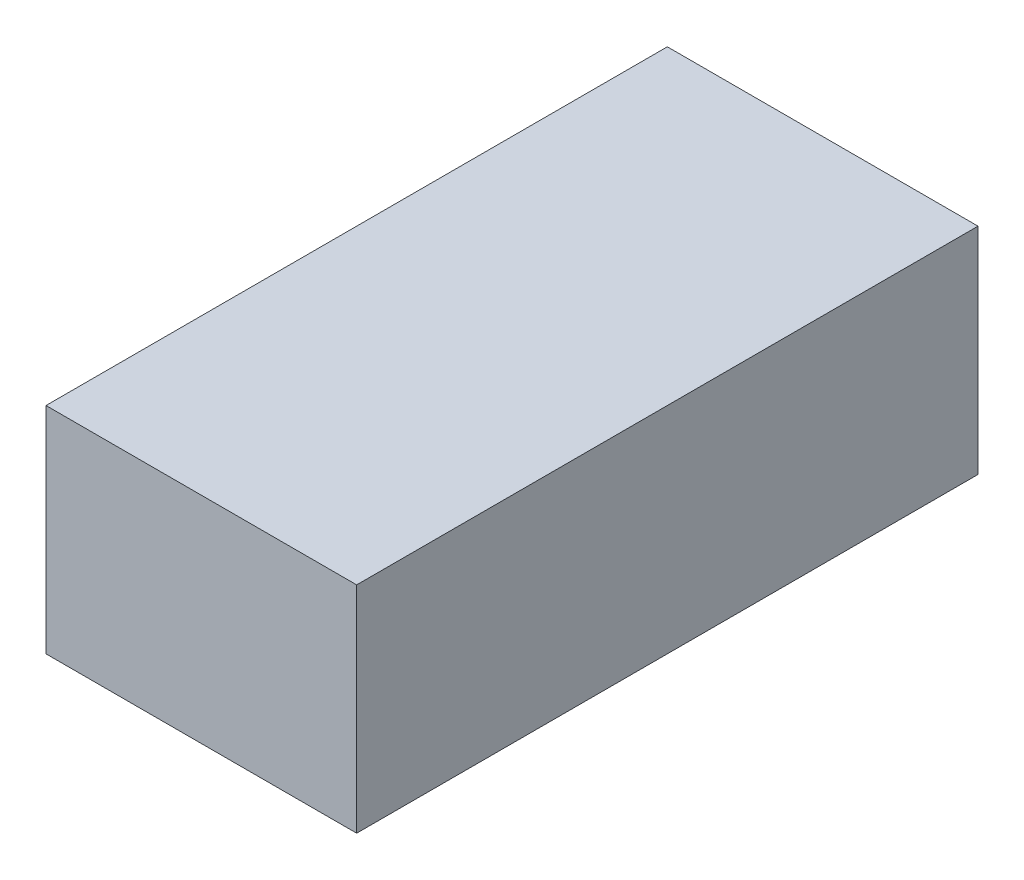
ISO-10303-21;
HEADER;
FILE_DESCRIPTION(('STEP AP214'),'2;1');
FILE_NAME('part.step','',(''),(''),'','','');
FILE_SCHEMA(('AUTOMOTIVE_DESIGN { 1 0 10303 214 1 1 1 1 }'));
ENDSEC;
DATA;
#1=APPLICATION_CONTEXT('core data for automotive mechanical design processes');
#2=APPLICATION_PROTOCOL_DEFINITION('international standard','automotive_design',2000,#1);
#3=PRODUCT_CONTEXT('',#1,'mechanical');
#4=PRODUCT('Part','Part','',(#3));
#5=PRODUCT_RELATED_PRODUCT_CATEGORY('part','',(#4));
#6=PRODUCT_DEFINITION_FORMATION('','',#4);
#7=PRODUCT_DEFINITION_CONTEXT('part definition',#1,'design');
#8=PRODUCT_DEFINITION('design','',#6,#7);
#9=PRODUCT_DEFINITION_SHAPE('','',#8);
#10=(LENGTH_UNIT() NAMED_UNIT(*) SI_UNIT(.MILLI.,.METRE.));
#11=(NAMED_UNIT(*) PLANE_ANGLE_UNIT() SI_UNIT($,.RADIAN.));
#12=(NAMED_UNIT(*) SI_UNIT($,.STERADIAN.) SOLID_ANGLE_UNIT());
#13=UNCERTAINTY_MEASURE_WITH_UNIT(LENGTH_MEASURE(1.E-05),#10,'distance_accuracy_value','');
#14=(GEOMETRIC_REPRESENTATION_CONTEXT(3) GLOBAL_UNCERTAINTY_ASSIGNED_CONTEXT((#13)) GLOBAL_UNIT_ASSIGNED_CONTEXT((#10,
#11,#12)) REPRESENTATION_CONTEXT('',''));
#15=CARTESIAN_POINT('',(0.,0.,0.));
#16=DIRECTION('',(0.,0.,1.));
#17=DIRECTION('',(1.,0.,0.));
#18=AXIS2_PLACEMENT_3D('',#15,#16,#17);
#19=CARTESIAN_POINT('',(6.5,9.,13.));
#20=DIRECTION('',(-1.,0.,0.));
#21=DIRECTION('',(0.,0.,1.));
#22=AXIS2_PLACEMENT_3D('',#19,#20,#21);
#23=PLANE('',#22);
#24=DIRECTION('',(0.,0.,-1.));
#25=VECTOR('',#24,1.);
#26=CARTESIAN_POINT('',(6.5,0.,13.));
#27=LINE('',#26,#25);
#28=CARTESIAN_POINT('',(6.5,0.,13.));
#29=VERTEX_POINT('',#28);
#30=CARTESIAN_POINT('',(6.5,0.,-13.));
#31=VERTEX_POINT('',#30);
#32=EDGE_CURVE('E102',#29,#31,#27,.T.);
#33=ORIENTED_EDGE('',*,*,#32,.T.);
#34=DIRECTION('',(0.,-1.,0.));
#35=VECTOR('',#34,1.);
#36=CARTESIAN_POINT('',(6.5,9.,-13.));
#37=LINE('',#36,#35);
#38=CARTESIAN_POINT('',(6.5,9.,-13.));
#39=VERTEX_POINT('',#38);
#40=EDGE_CURVE('E11',#39,#31,#37,.T.);
#41=ORIENTED_EDGE('',*,*,#40,.F.);
#42=DIRECTION('',(0.,0.,-1.));
#43=VECTOR('',#42,1.);
#44=CARTESIAN_POINT('',(6.5,9.,13.));
#45=LINE('',#44,#43);
#46=CARTESIAN_POINT('',(6.5,9.,13.));
#47=VERTEX_POINT('',#46);
#48=EDGE_CURVE('E90',#47,#39,#45,.T.);
#49=ORIENTED_EDGE('',*,*,#48,.F.);
#50=DIRECTION('',(0.,-1.,0.));
#51=VECTOR('',#50,1.);
#52=CARTESIAN_POINT('',(6.5,9.,13.));
#53=LINE('',#52,#51);
#54=EDGE_CURVE('E98',#47,#29,#53,.T.);
#55=ORIENTED_EDGE('',*,*,#54,.T.);
#56=EDGE_LOOP('',(#33,#41,#49,#55));
#57=FACE_BOUND('',#56,.T.);
#58=ADVANCED_FACE('F39',(#57),#23,.F.);
#59=CARTESIAN_POINT('',(-6.5,9.,-13.));
#60=DIRECTION('',(0.,0.,1.));
#61=DIRECTION('',(1.,0.,0.));
#62=AXIS2_PLACEMENT_3D('',#59,#60,#61);
#63=PLANE('',#62);
#64=DIRECTION('',(-1.,0.,0.));
#65=VECTOR('',#64,1.);
#66=CARTESIAN_POINT('',(-6.5,0.,-13.));
#67=LINE('',#66,#65);
#68=CARTESIAN_POINT('',(-6.5,0.,-13.));
#69=VERTEX_POINT('',#68);
#70=EDGE_CURVE('E94',#31,#69,#67,.T.);
#71=ORIENTED_EDGE('',*,*,#70,.T.);
#72=DIRECTION('',(0.,-1.,0.));
#73=VECTOR('',#72,1.);
#74=CARTESIAN_POINT('',(-6.5,9.,-13.));
#75=LINE('',#74,#73);
#76=CARTESIAN_POINT('',(-6.5,9.,-13.));
#77=VERTEX_POINT('',#76);
#78=EDGE_CURVE('E47',#77,#69,#75,.T.);
#79=ORIENTED_EDGE('',*,*,#78,.F.);
#80=DIRECTION('',(-1.,0.,0.));
#81=VECTOR('',#80,1.);
#82=CARTESIAN_POINT('',(-6.5,9.,-13.));
#83=LINE('',#82,#81);
#84=EDGE_CURVE('E85',#39,#77,#83,.T.);
#85=ORIENTED_EDGE('',*,*,#84,.F.);
#86=ORIENTED_EDGE('',*,*,#40,.T.);
#87=EDGE_LOOP('',(#71,#79,#85,#86));
#88=FACE_BOUND('',#87,.T.);
#89=ADVANCED_FACE('F93',(#88),#63,.F.);
#90=CARTESIAN_POINT('',(-6.5,9.,13.));
#91=DIRECTION('',(1.,0.,0.));
#92=DIRECTION('',(0.,0.,-1.));
#93=AXIS2_PLACEMENT_3D('',#90,#91,#92);
#94=PLANE('',#93);
#95=DIRECTION('',(0.,0.,1.));
#96=VECTOR('',#95,1.);
#97=CARTESIAN_POINT('',(-6.5,0.,13.));
#98=LINE('',#97,#96);
#99=CARTESIAN_POINT('',(-6.5,0.,13.));
#100=VERTEX_POINT('',#99);
#101=EDGE_CURVE('E72',#69,#100,#98,.T.);
#102=ORIENTED_EDGE('',*,*,#101,.T.);
#103=DIRECTION('',(0.,-1.,0.));
#104=VECTOR('',#103,1.);
#105=CARTESIAN_POINT('',(-6.5,9.,13.));
#106=LINE('',#105,#104);
#107=CARTESIAN_POINT('',(-6.5,9.,13.));
#108=VERTEX_POINT('',#107);
#109=EDGE_CURVE('E95',#108,#100,#106,.T.);
#110=ORIENTED_EDGE('',*,*,#109,.F.);
#111=DIRECTION('',(0.,0.,1.));
#112=VECTOR('',#111,1.);
#113=CARTESIAN_POINT('',(-6.5,9.,13.));
#114=LINE('',#113,#112);
#115=EDGE_CURVE('E88',#77,#108,#114,.T.);
#116=ORIENTED_EDGE('',*,*,#115,.F.);
#117=ORIENTED_EDGE('',*,*,#78,.T.);
#118=EDGE_LOOP('',(#102,#110,#116,#117));
#119=FACE_BOUND('',#118,.T.);
#120=ADVANCED_FACE('F96',(#119),#94,.F.);
#121=CARTESIAN_POINT('',(-6.5,9.,13.));
#122=DIRECTION('',(0.,0.,-1.));
#123=DIRECTION('',(-1.,0.,0.));
#124=AXIS2_PLACEMENT_3D('',#121,#122,#123);
#125=PLANE('',#124);
#126=DIRECTION('',(1.,0.,0.));
#127=VECTOR('',#126,1.);
#128=CARTESIAN_POINT('',(-6.5,0.,13.));
#129=LINE('',#128,#127);
#130=EDGE_CURVE('E78',#100,#29,#129,.T.);
#131=ORIENTED_EDGE('',*,*,#130,.T.);
#132=ORIENTED_EDGE('',*,*,#54,.F.);
#133=DIRECTION('',(1.,0.,0.));
#134=VECTOR('',#133,1.);
#135=CARTESIAN_POINT('',(-6.5,9.,13.));
#136=LINE('',#135,#134);
#137=EDGE_CURVE('E55',#108,#47,#136,.T.);
#138=ORIENTED_EDGE('',*,*,#137,.F.);
#139=ORIENTED_EDGE('',*,*,#109,.T.);
#140=EDGE_LOOP('',(#131,#132,#138,#139));
#141=FACE_BOUND('',#140,.T.);
#142=ADVANCED_FACE('F109',(#141),#125,.F.);
#143=CARTESIAN_POINT('',(0.,9.,0.));
#144=DIRECTION('',(0.,-1.,0.));
#145=DIRECTION('',(0.,0.,-1.));
#146=AXIS2_PLACEMENT_3D('',#143,#144,#145);
#147=PLANE('',#146);
#148=ORIENTED_EDGE('',*,*,#48,.T.);
#149=ORIENTED_EDGE('',*,*,#84,.T.);
#150=ORIENTED_EDGE('',*,*,#115,.T.);
#151=ORIENTED_EDGE('',*,*,#137,.T.);
#152=EDGE_LOOP('',(#148,#149,#150,#151));
#153=FACE_BOUND('',#152,.T.);
#154=ADVANCED_FACE('F86',(#153),#147,.F.);
#155=CARTESIAN_POINT('',(0.,0.,0.));
#156=DIRECTION('',(0.,-1.,0.));
#157=DIRECTION('',(0.,0.,-1.));
#158=AXIS2_PLACEMENT_3D('',#155,#156,#157);
#159=PLANE('',#158);
#160=ORIENTED_EDGE('',*,*,#32,.F.);
#161=ORIENTED_EDGE('',*,*,#130,.F.);
#162=ORIENTED_EDGE('',*,*,#101,.F.);
#163=ORIENTED_EDGE('',*,*,#70,.F.);
#164=EDGE_LOOP('',(#160,#161,#162,#163));
#165=FACE_BOUND('',#164,.T.);
#166=ADVANCED_FACE('F112',(#165),#159,.T.);
#167=CLOSED_SHELL('',(#58,#89,#120,#142,#154,#166));
#168=MANIFOLD_SOLID_BREP('B2',#167);
#169=ADVANCED_BREP_SHAPE_REPRESENTATION('',(#18,#168),#14);
#170=SHAPE_DEFINITION_REPRESENTATION(#9,#169);
ENDSEC;
END-ISO-10303-21;
